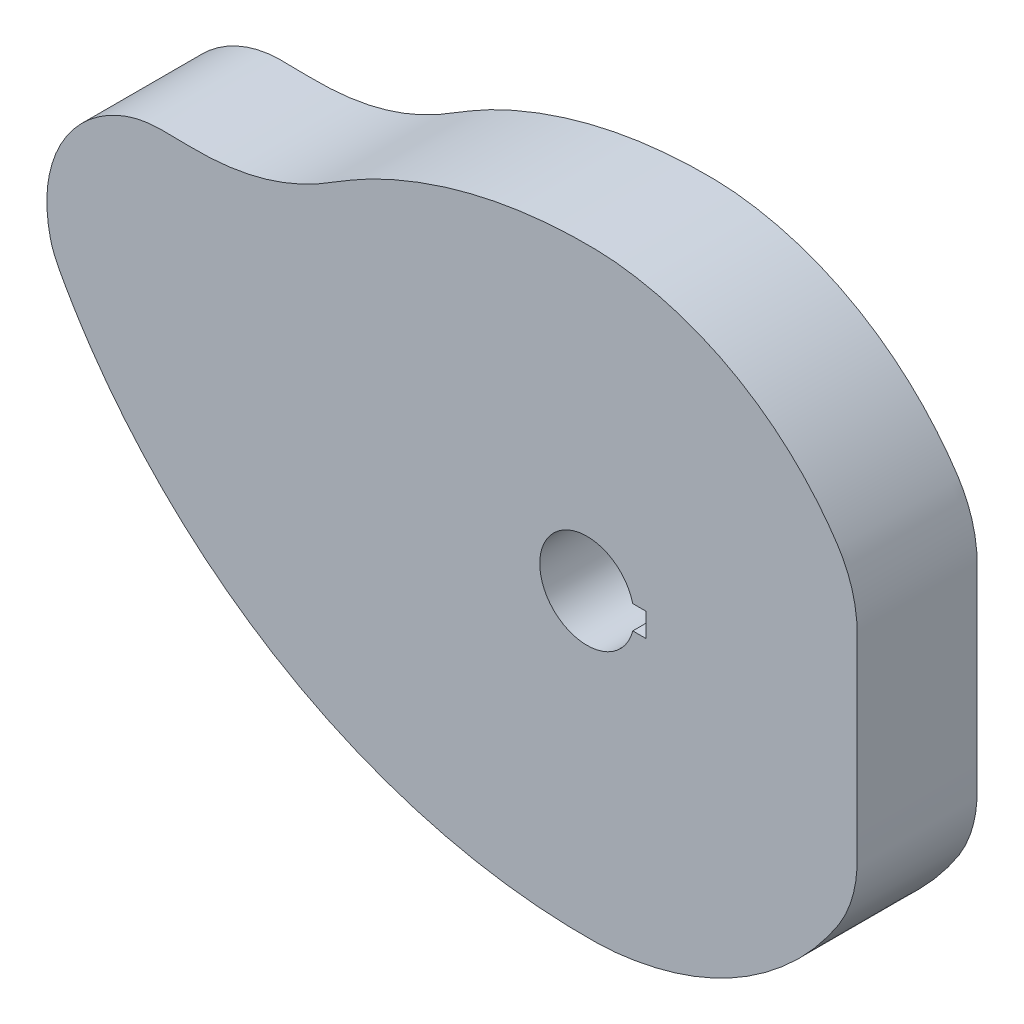
ISO-10303-21;
HEADER;
FILE_DESCRIPTION(('STEP AP214'),'2;1');
FILE_NAME('part.step','',(''),(''),'','','');
FILE_SCHEMA(('AUTOMOTIVE_DESIGN { 1 0 10303 214 1 1 1 1 }'));
ENDSEC;
DATA;
#1=APPLICATION_CONTEXT('core data for automotive mechanical design processes');
#2=APPLICATION_PROTOCOL_DEFINITION('international standard','automotive_design',2000,#1);
#3=PRODUCT_CONTEXT('',#1,'mechanical');
#4=PRODUCT('Part','Part','',(#3));
#5=PRODUCT_RELATED_PRODUCT_CATEGORY('part','',(#4));
#6=PRODUCT_DEFINITION_FORMATION('','',#4);
#7=PRODUCT_DEFINITION_CONTEXT('part definition',#1,'design');
#8=PRODUCT_DEFINITION('design','',#6,#7);
#9=PRODUCT_DEFINITION_SHAPE('','',#8);
#10=(LENGTH_UNIT() NAMED_UNIT(*) SI_UNIT(.MILLI.,.METRE.));
#11=(NAMED_UNIT(*) PLANE_ANGLE_UNIT() SI_UNIT($,.RADIAN.));
#12=(NAMED_UNIT(*) SI_UNIT($,.STERADIAN.) SOLID_ANGLE_UNIT());
#13=UNCERTAINTY_MEASURE_WITH_UNIT(LENGTH_MEASURE(1.E-05),#10,'distance_accuracy_value','');
#14=(GEOMETRIC_REPRESENTATION_CONTEXT(3) GLOBAL_UNCERTAINTY_ASSIGNED_CONTEXT((#13)) GLOBAL_UNIT_ASSIGNED_CONTEXT((#10,
#11,#12)) REPRESENTATION_CONTEXT('',''));
#15=CARTESIAN_POINT('',(0.,0.,0.));
#16=DIRECTION('',(0.,0.,1.));
#17=DIRECTION('',(1.,0.,0.));
#18=AXIS2_PLACEMENT_3D('',#15,#16,#17);
#19=CARTESIAN_POINT('',(-52.259233797283,-121.565831286042,25.4));
#20=DIRECTION('',(0.,0.,-1.));
#21=DIRECTION('',(-1.,0.,0.));
#22=AXIS2_PLACEMENT_3D('',#19,#20,#21);
#23=PLANE('',#22);
#24=CARTESIAN_POINT('',(-28.84960940884,124.941592011591,25.4));
#25=CARTESIAN_POINT('',(-48.0172973596402,122.192382834509,25.4));
#26=CARTESIAN_POINT('',(-66.6004944987315,116.749663241486,25.4));
#27=CARTESIAN_POINT('',(-84.2227067174397,108.723702302296,25.4));
#28=CARTESIAN_POINT('',(-88.8344062585629,106.623323534808,25.4));
#29=CARTESIAN_POINT('',(-97.900665141728,102.077540904734,25.4));
#30=CARTESIAN_POINT('',(-110.693663800941,93.768091000888,25.4));
#31=CARTESIAN_POINT('',(-119.707980614509,89.0740002139184,25.4));
#32=CARTESIAN_POINT('',(-124.364668699749,87.0753457412051,25.4));
#33=CARTESIAN_POINT('',(-134.644197589061,82.6633632300439,25.4));
#34=CARTESIAN_POINT('',(-145.507212428235,79.9933047159127,25.4));
#35=CARTESIAN_POINT('',(-156.660747873486,79.1371791780954,25.4));
#36=CARTESIAN_POINT('',(-161.496559267762,78.7659908987352,25.4));
#37=CARTESIAN_POINT('',(-171.221339831321,78.7161496068171,25.4));
#38=CARTESIAN_POINT('',(-186.352461546201,79.4198612164382,25.4));
#39=CARTESIAN_POINT('',(-195.681579205646,76.4217455758355,25.4));
#40=CARTESIAN_POINT('',(-200.042029759643,74.2982287885516,25.4));
#41=CARTESIAN_POINT('',(-217.372093969367,65.8585774685025,25.4));
#42=CARTESIAN_POINT('',(-227.881133526544,49.6994027524833,25.4));
#43=CARTESIAN_POINT('',(-228.567760678363,30.4357742502636,25.4));
#44=CARTESIAN_POINT('',(-228.675211048643,27.421206576962,25.4));
#45=CARTESIAN_POINT('',(-228.353100615053,21.3729301608058,25.4));
#46=CARTESIAN_POINT('',(-226.537007616112,12.0030729899717,25.4));
#47=CARTESIAN_POINT('',(-223.710348083425,6.67220053440763,25.4));
#48=CARTESIAN_POINT('',(-222.25,4.03277875791459,25.4));
#49=CARTESIAN_POINT('',(-220.786027211764,1.38680571811546,25.4));
#50=CARTESIAN_POINT('',(-217.763577608375,-3.85285285828359,25.4));
#51=CARTESIAN_POINT('',(-212.945017356871,-11.5563582692333,25.4));
#52=CARTESIAN_POINT('',(-209.556036578675,-16.5667507575796,25.4));
#53=CARTESIAN_POINT('',(-207.81736266284,-19.0408976138587,25.4));
#54=CARTESIAN_POINT('',(-165.939670094104,-78.6331883093797,25.4));
#55=CARTESIAN_POINT('',(-103.494941124399,-116.125028343193,25.4));
#56=CARTESIAN_POINT('',(-31.2116151987587,-125.075058418489,25.4));
#57=CARTESIAN_POINT('',(-27.7634006207359,-125.502011990204,25.4));
#58=CARTESIAN_POINT('',(-20.8494501652087,-126.214411474954,25.4));
#59=CARTESIAN_POINT('',(-10.4236393911341,-126.857411734703,25.4));
#60=CARTESIAN_POINT('',(-3.47454646371136,-127.,25.4));
#61=CARTESIAN_POINT('',(0.,-127.,25.4));
#62=CARTESIAN_POINT('',(3.46647594364313,-127.,25.4));
#63=CARTESIAN_POINT('',(10.3994278309294,-126.858073360616,25.4));
#64=CARTESIAN_POINT('',(20.8072055518038,-125.428027713954,25.4));
#65=CARTESIAN_POINT('',(27.6001690464834,-124.013092551042,25.4));
#66=CARTESIAN_POINT('',(30.9620496941261,-123.167980736628,25.4));
#67=CARTESIAN_POINT('',(59.4391898885441,-116.009378114641,25.4));
#68=CARTESIAN_POINT('',(83.8974747404313,-99.7617503722282,25.4));
#69=CARTESIAN_POINT('',(101.535282732004,-76.2862134368461,25.4));
#70=CARTESIAN_POINT('',(102.032465254216,-75.6244743664701,25.4));
#71=CARTESIAN_POINT('',(103.013891980486,-74.2912753161623,25.4));
#72=CARTESIAN_POINT('',(104.447260388009,-72.2621984616341,25.4));
#73=CARTESIAN_POINT('',(105.375804353249,-70.8916422856984,25.4));
#74=CARTESIAN_POINT('',(105.833333333333,-70.201891395856,25.4));
#75=CARTESIAN_POINT('',(106.289772373186,-69.5137836527371,25.4));
#76=CARTESIAN_POINT('',(107.189228624875,-68.128665132993,25.4));
#77=CARTESIAN_POINT('',(108.38736853485,-65.9499252792349,25.4));
#78=CARTESIAN_POINT('',(109.126133137904,-64.4723720235287,25.4));
#79=CARTESIAN_POINT('',(109.47729400244,-63.7250334720941,25.4));
#80=CARTESIAN_POINT('',(111.593713039351,-59.2208825344171,25.4));
#81=CARTESIAN_POINT('',(113.030335386188,-54.456145244519,25.4));
#82=CARTESIAN_POINT('',(113.756415965329,-49.5327914890216,25.4));
#83=CARTESIAN_POINT('',(113.876888839295,-48.7158978913724,25.4));
#84=CARTESIAN_POINT('',(114.077999962908,-47.0762360121631,25.4));
#85=CARTESIAN_POINT('',(114.3,-44.5983227127417,25.4));
#86=CARTESIAN_POINT('',(114.3,-42.9468641292563,25.4));
#87=CARTESIAN_POINT('',(114.3,-42.1211348375136,25.4));
#88=CARTESIAN_POINT('',(114.3,-41.2954055457709,25.4));
#89=CARTESIAN_POINT('',(114.3,-39.6439469622856,25.4));
#90=CARTESIAN_POINT('',(114.3,-37.1667590870575,25.4));
#91=CARTESIAN_POINT('',(114.3,-35.5153005035721,25.4));
#92=CARTESIAN_POINT('',(114.3,-34.6895712118295,25.4));
#93=CARTESIAN_POINT('',(114.3,-11.5631904039431,25.4));
#94=CARTESIAN_POINT('',(114.3,11.5631904039432,25.4));
#95=CARTESIAN_POINT('',(114.3,34.6895712118295,25.4));
#96=CARTESIAN_POINT('',(114.3,35.5153005035722,25.4));
#97=CARTESIAN_POINT('',(114.3,37.1667590870575,25.4));
#98=CARTESIAN_POINT('',(114.3,39.6439469622856,25.4));
#99=CARTESIAN_POINT('',(114.3,41.2954055457709,25.4));
#100=CARTESIAN_POINT('',(114.3,42.1211348375136,25.4));
#101=CARTESIAN_POINT('',(114.3,42.9468641292563,25.4));
#102=CARTESIAN_POINT('',(114.3,44.5983227127416,25.4));
#103=CARTESIAN_POINT('',(114.077999962908,47.076236012163,25.4));
#104=CARTESIAN_POINT('',(113.876888839295,48.7158978913724,25.4));
#105=CARTESIAN_POINT('',(113.756415965329,49.5327914890215,25.4));
#106=CARTESIAN_POINT('',(113.030335386188,54.456145244519,25.4));
#107=CARTESIAN_POINT('',(111.593713039351,59.2208825344171,25.4));
#108=CARTESIAN_POINT('',(109.47729400244,63.7250334720941,25.4));
#109=CARTESIAN_POINT('',(109.126133137904,64.4723720235287,25.4));
#110=CARTESIAN_POINT('',(108.38736853485,65.9499252792349,25.4));
#111=CARTESIAN_POINT('',(107.189228624875,68.128665132993,25.4));
#112=CARTESIAN_POINT('',(106.289772373186,69.5137836527371,25.4));
#113=CARTESIAN_POINT('',(105.833333333333,70.201891395856,25.4));
#114=CARTESIAN_POINT('',(105.375804353249,70.8916422856983,25.4));
#115=CARTESIAN_POINT('',(104.447260388009,72.2621984616341,25.4));
#116=CARTESIAN_POINT('',(103.013891980486,74.2912753161623,25.4));
#117=CARTESIAN_POINT('',(102.032465254216,75.6244743664701,25.4));
#118=CARTESIAN_POINT('',(101.535282732004,76.2862134368461,25.4));
#119=CARTESIAN_POINT('',(83.8974747404313,99.7617503722281,25.4));
#120=CARTESIAN_POINT('',(59.4391898885441,116.009378114641,25.4));
#121=CARTESIAN_POINT('',(30.9620496941261,123.167980736628,25.4));
#122=CARTESIAN_POINT('',(27.6001690464833,124.013092551042,25.4));
#123=CARTESIAN_POINT('',(20.8072055518037,125.428027713954,25.4));
#124=CARTESIAN_POINT('',(10.3994278309294,126.82259170077,25.4));
#125=CARTESIAN_POINT('',(3.46647594364314,127.,25.4));
#126=CARTESIAN_POINT('',(0.,127.,25.4));
#127=CARTESIAN_POINT('',(-3.21366105307736,127.,25.4));
#128=CARTESIAN_POINT('',(-9.6409831592321,126.847525334192,25.4));
#129=CARTESIAN_POINT('',(-19.2846412210536,126.159454223397,25.4));
#130=CARTESIAN_POINT('',(-25.6685026155249,125.397856116678,25.4));
#131=CARTESIAN_POINT('',(-28.84960940884,124.941592011591,25.4));
#132=(BOUNDED_CURVE() B_SPLINE_CURVE(3,(#24,#25,#26,#27,#28,#29,#30,#31,#32,#33,#34,#35,#36,#37,
#38,#39,#40,#41,#42,#43,#44,#45,#46,#47,#48,#49,#50,#51,#52,#53,#54,#55,#56,#57,#58,#59,#60,#61,
#62,#63,#64,#65,#66,#67,#68,#69,#70,#71,#72,#73,#74,#75,#76,#77,#78,#79,#80,#81,#82,#83,#84,#85,
#86,#87,#88,#89,#90,#91,#92,#93,#94,#95,#96,#97,#98,#99,#100,#101,#102,#103,#104,#105,#106,#107,
#108,#109,#110,#111,#112,#113,#114,#115,#116,#117,#118,#119,#120,#121,#122,#123,#124,#125,#126,
#127,#128,#129,#130,#131),.UNSPECIFIED.,.T.,.F.) B_SPLINE_CURVE_WITH_KNOTS((4,3,1,1,3,3,1,1,3,3,
1,1,3,1,1,3,3,1,1,3,1,1,3,3,1,1,3,1,1,3,3,1,1,3,1,1,3,3,1,1,3,1,1,3,3,1,1,3,1,1,3,3,1,1,3,1,1,
4),(0.,0.0611577489783689,0.0772714366643011,0.0933851243502334,0.109498812036166,
0.144749628302519,0.160171880714391,0.175594133126263,0.191016385538136,0.246475012386609,
0.256066888390429,0.265658764394248,0.275250640398068,0.28486632423202,0.294482008065972,
0.304097691899923,0.522437324040707,0.533485763419728,0.544534202798749,0.55558264217777,
0.566605418739309,0.577628195300849,0.588650971862388,0.678455419543698,0.681087361630865,
0.683719303718032,0.686351245805198,0.688976917995392,0.691602590185585,0.694228262375778,
0.70994009509362,0.712565767283813,0.715191439474007,0.7178171116642,0.720442783854393,
0.723068456044586,0.72569412823478,0.799231903331667,0.80185757552186,0.804483247712053,
0.807108919902247,0.80973459209244,0.812360264282633,0.814985936472826,0.830697769190669,
0.833323441380862,0.835949113571055,0.838574785761248,0.841206727848415,0.843838669935582,
0.846470612022749,0.936275059704061,0.9472978362656,0.95832061282714,0.969343389388679,
0.979562259592453,0.989781129796226,1.),
.UNSPECIFIED.) CURVE() GEOMETRIC_REPRESENTATION_ITEM() RATIONAL_B_SPLINE_CURVE((1.,
0.993246692951414,0.993246692951414,1.,1.,1.,1.,1.,1.,0.991010311958486,0.991010311958486,1.,1.,
1.,1.,1.,1.,0.904799807934197,0.904799807934197,1.,1.,1.,1.,1.,1.,1.,1.,1.,1.,1.,
0.942731011236939,0.942731011236939,1.,1.,1.,1.,1.,1.,1.,1.,1.,1.,1.,0.961817688978742,
0.961817688978742,1.,1.,1.,1.,1.,1.,1.,1.,1.,1.,1.,0.992866351251034,0.992866351251034,1.,1.,1.,
1.,1.,1.,1.,1.,1.,1.,1.,1.,1.,1.,1.,1.,1.,1.,1.,1.,1.,1.,1.,1.,0.992866351251034,
0.992866351251034,1.,1.,1.,1.,1.,1.,1.,1.,1.,1.,1.,0.961817688978742,0.961817688978742,1.,1.,1.,
1.,1.,1.,1.,1.,1.,1.,1.)) REPRESENTATION_ITEM(''));
#133=CARTESIAN_POINT('',(-28.84960940884,124.941592011591,25.4));
#134=VERTEX_POINT('',#133);
#135=EDGE_CURVE('E11',#134,#134,#132,.T.);
#136=ORIENTED_EDGE('',*,*,#135,.T.);
#137=EDGE_LOOP('',(#136));
#138=FACE_BOUND('',#137,.T.);
#139=DIRECTION('',(0.,1.,0.));
#140=VECTOR('',#139,1.);
#141=CARTESIAN_POINT('',(25.,5.,25.4));
#142=LINE('',#141,#140);
#143=CARTESIAN_POINT('',(25.,-5.,25.4));
#144=VERTEX_POINT('',#143);
#145=CARTESIAN_POINT('',(25.,5.,25.4));
#146=VERTEX_POINT('',#145);
#147=EDGE_CURVE('E93',#144,#146,#142,.T.);
#148=ORIENTED_EDGE('',*,*,#147,.F.);
#149=DIRECTION('',(1.,0.,0.));
#150=VECTOR('',#149,1.);
#151=CARTESIAN_POINT('',(19.3649167310371,-5.,25.4));
#152=LINE('',#151,#150);
#153=CARTESIAN_POINT('',(19.3649167310371,-5.,25.4));
#154=VERTEX_POINT('',#153);
#155=EDGE_CURVE('E107',#154,#144,#152,.T.);
#156=ORIENTED_EDGE('',*,*,#155,.F.);
#157=CARTESIAN_POINT('',(0.,0.,25.4));
#158=DIRECTION('',(0.,0.,1.));
#159=DIRECTION('',(1.,0.,0.));
#160=AXIS2_PLACEMENT_3D('',#157,#158,#159);
#161=CIRCLE('',#160,20.);
#162=CARTESIAN_POINT('',(19.3649167310371,5.,25.4));
#163=VERTEX_POINT('',#162);
#164=EDGE_CURVE('E105',#163,#154,#161,.T.);
#165=ORIENTED_EDGE('',*,*,#164,.F.);
#166=DIRECTION('',(-1.,0.,0.));
#167=VECTOR('',#166,1.);
#168=CARTESIAN_POINT('',(19.3649167310371,5.,25.4));
#169=LINE('',#168,#167);
#170=EDGE_CURVE('E103',#146,#163,#169,.T.);
#171=ORIENTED_EDGE('',*,*,#170,.F.);
#172=EDGE_LOOP('',(#148,#156,#165,#171));
#173=FACE_BOUND('',#172,.T.);
#174=ADVANCED_FACE('F34',(#138,#173),#23,.F.);
#175=CARTESIAN_POINT('',(-52.259233797283,-121.565831286042,-25.4));
#176=DIRECTION('',(0.,0.,-1.));
#177=DIRECTION('',(-1.,0.,0.));
#178=AXIS2_PLACEMENT_3D('',#175,#176,#177);
#179=PLANE('',#178);
#180=CARTESIAN_POINT('',(-28.84960940884,124.941592011591,-25.4));
#181=CARTESIAN_POINT('',(-48.0172973596402,122.192382834509,-25.4));
#182=CARTESIAN_POINT('',(-66.6004944987315,116.749663241486,-25.4));
#183=CARTESIAN_POINT('',(-84.2227067174397,108.723702302296,-25.4));
#184=CARTESIAN_POINT('',(-88.8344062585629,106.623323534808,-25.4));
#185=CARTESIAN_POINT('',(-97.900665141728,102.077540904734,-25.4));
#186=CARTESIAN_POINT('',(-110.693663800941,93.768091000888,-25.4));
#187=CARTESIAN_POINT('',(-119.707980614509,89.0740002139184,-25.4));
#188=CARTESIAN_POINT('',(-124.364668699749,87.0753457412051,-25.4));
#189=CARTESIAN_POINT('',(-134.644197589061,82.6633632300439,-25.4));
#190=CARTESIAN_POINT('',(-145.507212428235,79.9933047159127,-25.4));
#191=CARTESIAN_POINT('',(-156.660747873486,79.1371791780954,-25.4));
#192=CARTESIAN_POINT('',(-161.496559267762,78.7659908987352,-25.4));
#193=CARTESIAN_POINT('',(-171.221339831321,78.7161496068171,-25.4));
#194=CARTESIAN_POINT('',(-186.352461546201,79.4198612164382,-25.4));
#195=CARTESIAN_POINT('',(-195.681579205646,76.4217455758355,-25.4));
#196=CARTESIAN_POINT('',(-200.042029759643,74.2982287885516,-25.4));
#197=CARTESIAN_POINT('',(-217.372093969367,65.8585774685025,-25.4));
#198=CARTESIAN_POINT('',(-227.881133526544,49.6994027524833,-25.4));
#199=CARTESIAN_POINT('',(-228.567760678363,30.4357742502636,-25.4));
#200=CARTESIAN_POINT('',(-228.675211048643,27.421206576962,-25.4));
#201=CARTESIAN_POINT('',(-228.353100615053,21.3729301608058,-25.4));
#202=CARTESIAN_POINT('',(-226.537007616112,12.0030729899717,-25.4));
#203=CARTESIAN_POINT('',(-223.710348083425,6.67220053440763,-25.4));
#204=CARTESIAN_POINT('',(-222.25,4.03277875791459,-25.4));
#205=CARTESIAN_POINT('',(-220.786027211764,1.38680571811546,-25.4));
#206=CARTESIAN_POINT('',(-217.763577608375,-3.85285285828359,-25.4));
#207=CARTESIAN_POINT('',(-212.945017356871,-11.5563582692333,-25.4));
#208=CARTESIAN_POINT('',(-209.556036578675,-16.5667507575796,-25.4));
#209=CARTESIAN_POINT('',(-207.81736266284,-19.0408976138587,-25.4));
#210=CARTESIAN_POINT('',(-165.939670094104,-78.6331883093797,-25.4));
#211=CARTESIAN_POINT('',(-103.494941124399,-116.125028343193,-25.4));
#212=CARTESIAN_POINT('',(-31.2116151987587,-125.075058418489,-25.4));
#213=CARTESIAN_POINT('',(-27.7634006207359,-125.502011990204,-25.4));
#214=CARTESIAN_POINT('',(-20.8494501652087,-126.214411474954,-25.4));
#215=CARTESIAN_POINT('',(-10.4236393911341,-126.857411734703,-25.4));
#216=CARTESIAN_POINT('',(-3.47454646371136,-127.,-25.4));
#217=CARTESIAN_POINT('',(0.,-127.,-25.4));
#218=CARTESIAN_POINT('',(3.46647594364313,-127.,-25.4));
#219=CARTESIAN_POINT('',(10.3994278309294,-126.858073360616,-25.4));
#220=CARTESIAN_POINT('',(20.8072055518038,-125.428027713954,-25.4));
#221=CARTESIAN_POINT('',(27.6001690464834,-124.013092551042,-25.4));
#222=CARTESIAN_POINT('',(30.9620496941261,-123.167980736628,-25.4));
#223=CARTESIAN_POINT('',(59.4391898885441,-116.009378114641,-25.4));
#224=CARTESIAN_POINT('',(83.8974747404313,-99.7617503722282,-25.4));
#225=CARTESIAN_POINT('',(101.535282732004,-76.2862134368461,-25.4));
#226=CARTESIAN_POINT('',(102.032465254216,-75.6244743664701,-25.4));
#227=CARTESIAN_POINT('',(103.013891980486,-74.2912753161623,-25.4));
#228=CARTESIAN_POINT('',(104.447260388009,-72.2621984616341,-25.4));
#229=CARTESIAN_POINT('',(105.375804353249,-70.8916422856984,-25.4));
#230=CARTESIAN_POINT('',(105.833333333333,-70.201891395856,-25.4));
#231=CARTESIAN_POINT('',(106.289772373186,-69.5137836527371,-25.4));
#232=CARTESIAN_POINT('',(107.189228624875,-68.128665132993,-25.4));
#233=CARTESIAN_POINT('',(108.38736853485,-65.9499252792349,-25.4));
#234=CARTESIAN_POINT('',(109.126133137904,-64.4723720235287,-25.4));
#235=CARTESIAN_POINT('',(109.47729400244,-63.7250334720941,-25.4));
#236=CARTESIAN_POINT('',(111.593713039351,-59.2208825344171,-25.4));
#237=CARTESIAN_POINT('',(113.030335386188,-54.456145244519,-25.4));
#238=CARTESIAN_POINT('',(113.756415965329,-49.5327914890216,-25.4));
#239=CARTESIAN_POINT('',(113.876888839295,-48.7158978913724,-25.4));
#240=CARTESIAN_POINT('',(114.077999962908,-47.0762360121631,-25.4));
#241=CARTESIAN_POINT('',(114.3,-44.5983227127417,-25.4));
#242=CARTESIAN_POINT('',(114.3,-42.9468641292563,-25.4));
#243=CARTESIAN_POINT('',(114.3,-42.1211348375136,-25.4));
#244=CARTESIAN_POINT('',(114.3,-41.2954055457709,-25.4));
#245=CARTESIAN_POINT('',(114.3,-39.6439469622856,-25.4));
#246=CARTESIAN_POINT('',(114.3,-37.1667590870575,-25.4));
#247=CARTESIAN_POINT('',(114.3,-35.5153005035721,-25.4));
#248=CARTESIAN_POINT('',(114.3,-34.6895712118295,-25.4));
#249=CARTESIAN_POINT('',(114.3,-11.5631904039431,-25.4));
#250=CARTESIAN_POINT('',(114.3,11.5631904039432,-25.4));
#251=CARTESIAN_POINT('',(114.3,34.6895712118295,-25.4));
#252=CARTESIAN_POINT('',(114.3,35.5153005035722,-25.4));
#253=CARTESIAN_POINT('',(114.3,37.1667590870575,-25.4));
#254=CARTESIAN_POINT('',(114.3,39.6439469622856,-25.4));
#255=CARTESIAN_POINT('',(114.3,41.2954055457709,-25.4));
#256=CARTESIAN_POINT('',(114.3,42.1211348375136,-25.4));
#257=CARTESIAN_POINT('',(114.3,42.9468641292563,-25.4));
#258=CARTESIAN_POINT('',(114.3,44.5983227127416,-25.4));
#259=CARTESIAN_POINT('',(114.077999962908,47.076236012163,-25.4));
#260=CARTESIAN_POINT('',(113.876888839295,48.7158978913724,-25.4));
#261=CARTESIAN_POINT('',(113.756415965329,49.5327914890215,-25.4));
#262=CARTESIAN_POINT('',(113.030335386188,54.456145244519,-25.4));
#263=CARTESIAN_POINT('',(111.593713039351,59.2208825344171,-25.4));
#264=CARTESIAN_POINT('',(109.47729400244,63.7250334720941,-25.4));
#265=CARTESIAN_POINT('',(109.126133137904,64.4723720235287,-25.4));
#266=CARTESIAN_POINT('',(108.38736853485,65.9499252792349,-25.4));
#267=CARTESIAN_POINT('',(107.189228624875,68.128665132993,-25.4));
#268=CARTESIAN_POINT('',(106.289772373186,69.5137836527371,-25.4));
#269=CARTESIAN_POINT('',(105.833333333333,70.201891395856,-25.4));
#270=CARTESIAN_POINT('',(105.375804353249,70.8916422856983,-25.4));
#271=CARTESIAN_POINT('',(104.447260388009,72.2621984616341,-25.4));
#272=CARTESIAN_POINT('',(103.013891980486,74.2912753161623,-25.4));
#273=CARTESIAN_POINT('',(102.032465254216,75.6244743664701,-25.4));
#274=CARTESIAN_POINT('',(101.535282732004,76.2862134368461,-25.4));
#275=CARTESIAN_POINT('',(83.8974747404313,99.7617503722281,-25.4));
#276=CARTESIAN_POINT('',(59.4391898885441,116.009378114641,-25.4));
#277=CARTESIAN_POINT('',(30.9620496941261,123.167980736628,-25.4));
#278=CARTESIAN_POINT('',(27.6001690464833,124.013092551042,-25.4));
#279=CARTESIAN_POINT('',(20.8072055518037,125.428027713954,-25.4));
#280=CARTESIAN_POINT('',(10.3994278309294,126.82259170077,-25.4));
#281=CARTESIAN_POINT('',(3.46647594364314,127.,-25.4));
#282=CARTESIAN_POINT('',(0.,127.,-25.4));
#283=CARTESIAN_POINT('',(-3.21366105307736,127.,-25.4));
#284=CARTESIAN_POINT('',(-9.6409831592321,126.847525334192,-25.4));
#285=CARTESIAN_POINT('',(-19.2846412210536,126.159454223397,-25.4));
#286=CARTESIAN_POINT('',(-25.6685026155249,125.397856116678,-25.4));
#287=CARTESIAN_POINT('',(-28.84960940884,124.941592011591,-25.4));
#288=(BOUNDED_CURVE() B_SPLINE_CURVE(3,(#180,#181,#182,#183,#184,#185,#186,#187,#188,#189,#190,
#191,#192,#193,#194,#195,#196,#197,#198,#199,#200,#201,#202,#203,#204,#205,#206,#207,#208,#209,
#210,#211,#212,#213,#214,#215,#216,#217,#218,#219,#220,#221,#222,#223,#224,#225,#226,#227,#228,
#229,#230,#231,#232,#233,#234,#235,#236,#237,#238,#239,#240,#241,#242,#243,#244,#245,#246,#247,
#248,#249,#250,#251,#252,#253,#254,#255,#256,#257,#258,#259,#260,#261,#262,#263,#264,#265,#266,
#267,#268,#269,#270,#271,#272,#273,#274,#275,#276,#277,#278,#279,#280,#281,#282,#283,#284,#285,
#286,#287),.UNSPECIFIED.,.T.,.F.) B_SPLINE_CURVE_WITH_KNOTS((4,3,1,1,3,3,1,1,3,3,1,1,3,1,1,3,3,
1,1,3,1,1,3,3,1,1,3,1,1,3,3,1,1,3,1,1,3,3,1,1,3,1,1,3,3,1,1,3,1,1,3,3,1,1,3,1,1,4),(0.,
0.0611577489783689,0.0772714366643011,0.0933851243502334,0.109498812036166,0.144749628302519,
0.160171880714391,0.175594133126263,0.191016385538136,0.246475012386609,0.256066888390429,
0.265658764394248,0.275250640398068,0.28486632423202,0.294482008065972,0.304097691899923,
0.522437324040707,0.533485763419728,0.544534202798749,0.55558264217777,0.566605418739309,
0.577628195300849,0.588650971862388,0.678455419543698,0.681087361630865,0.683719303718032,
0.686351245805198,0.688976917995392,0.691602590185585,0.694228262375778,0.70994009509362,
0.712565767283813,0.715191439474007,0.7178171116642,0.720442783854393,0.723068456044586,
0.72569412823478,0.799231903331667,0.80185757552186,0.804483247712053,0.807108919902247,
0.80973459209244,0.812360264282633,0.814985936472826,0.830697769190669,0.833323441380862,
0.835949113571055,0.838574785761248,0.841206727848415,0.843838669935582,0.846470612022749,
0.936275059704061,0.9472978362656,0.95832061282714,0.969343389388679,0.979562259592453,
0.989781129796226,1.),
.UNSPECIFIED.) CURVE() GEOMETRIC_REPRESENTATION_ITEM() RATIONAL_B_SPLINE_CURVE((1.,
0.993246692951414,0.993246692951414,1.,1.,1.,1.,1.,1.,0.991010311958486,0.991010311958486,1.,1.,
1.,1.,1.,1.,0.904799807934197,0.904799807934197,1.,1.,1.,1.,1.,1.,1.,1.,1.,1.,1.,
0.942731011236939,0.942731011236939,1.,1.,1.,1.,1.,1.,1.,1.,1.,1.,1.,0.961817688978742,
0.961817688978742,1.,1.,1.,1.,1.,1.,1.,1.,1.,1.,1.,0.992866351251034,0.992866351251034,1.,1.,1.,
1.,1.,1.,1.,1.,1.,1.,1.,1.,1.,1.,1.,1.,1.,1.,1.,1.,1.,1.,1.,1.,0.992866351251034,
0.992866351251034,1.,1.,1.,1.,1.,1.,1.,1.,1.,1.,1.,0.961817688978742,0.961817688978742,1.,1.,1.,
1.,1.,1.,1.,1.,1.,1.,1.)) REPRESENTATION_ITEM(''));
#289=CARTESIAN_POINT('',(-28.84960940884,124.941592011591,-25.4));
#290=VERTEX_POINT('',#289);
#291=EDGE_CURVE('E45',#290,#290,#288,.T.);
#292=ORIENTED_EDGE('',*,*,#291,.F.);
#293=EDGE_LOOP('',(#292));
#294=FACE_BOUND('',#293,.T.);
#295=DIRECTION('',(1.,0.,0.));
#296=VECTOR('',#295,1.);
#297=CARTESIAN_POINT('',(19.3649167310371,-5.,-25.4));
#298=LINE('',#297,#296);
#299=CARTESIAN_POINT('',(19.3649167310371,-5.,-25.4));
#300=VERTEX_POINT('',#299);
#301=CARTESIAN_POINT('',(25.,-5.,-25.4));
#302=VERTEX_POINT('',#301);
#303=EDGE_CURVE('E97',#300,#302,#298,.T.);
#304=ORIENTED_EDGE('',*,*,#303,.T.);
#305=DIRECTION('',(0.,1.,0.));
#306=VECTOR('',#305,1.);
#307=CARTESIAN_POINT('',(25.,5.,-25.4));
#308=LINE('',#307,#306);
#309=CARTESIAN_POINT('',(25.,5.,-25.4));
#310=VERTEX_POINT('',#309);
#311=EDGE_CURVE('E60',#302,#310,#308,.T.);
#312=ORIENTED_EDGE('',*,*,#311,.T.);
#313=DIRECTION('',(-1.,0.,0.));
#314=VECTOR('',#313,1.);
#315=CARTESIAN_POINT('',(19.3649167310371,5.,-25.4));
#316=LINE('',#315,#314);
#317=CARTESIAN_POINT('',(19.3649167310371,5.,-25.4));
#318=VERTEX_POINT('',#317);
#319=EDGE_CURVE('E80',#310,#318,#316,.T.);
#320=ORIENTED_EDGE('',*,*,#319,.T.);
#321=CARTESIAN_POINT('',(0.,0.,-25.4));
#322=DIRECTION('',(0.,0.,1.));
#323=DIRECTION('',(1.,0.,0.));
#324=AXIS2_PLACEMENT_3D('',#321,#322,#323);
#325=CIRCLE('',#324,20.);
#326=EDGE_CURVE('E89',#318,#300,#325,.T.);
#327=ORIENTED_EDGE('',*,*,#326,.T.);
#328=EDGE_LOOP('',(#304,#312,#320,#327));
#329=FACE_BOUND('',#328,.T.);
#330=ADVANCED_FACE('F96',(#294,#329),#179,.T.);
#331=DIRECTION('',(0.,0.,-1.));
#332=VECTOR('',#331,1.);
#333=SURFACE_OF_LINEAR_EXTRUSION('',#132,#332);
#334=ORIENTED_EDGE('',*,*,#135,.F.);
#335=EDGE_LOOP('',(#334));
#336=FACE_BOUND('',#335,.T.);
#337=ORIENTED_EDGE('',*,*,#291,.T.);
#338=EDGE_LOOP('',(#337));
#339=FACE_BOUND('',#338,.T.);
#340=ADVANCED_FACE('F36',(#336,#339),#333,.F.);
#341=CARTESIAN_POINT('',(25.,5.,25.4));
#342=DIRECTION('',(-1.,0.,0.));
#343=DIRECTION('',(0.,0.,1.));
#344=AXIS2_PLACEMENT_3D('',#341,#342,#343);
#345=PLANE('',#344);
#346=ORIENTED_EDGE('',*,*,#311,.F.);
#347=DIRECTION('',(0.,0.,-1.));
#348=VECTOR('',#347,1.);
#349=CARTESIAN_POINT('',(25.,-5.,25.4));
#350=LINE('',#349,#348);
#351=EDGE_CURVE('E109',#144,#302,#350,.T.);
#352=ORIENTED_EDGE('',*,*,#351,.F.);
#353=ORIENTED_EDGE('',*,*,#147,.T.);
#354=DIRECTION('',(0.,0.,-1.));
#355=VECTOR('',#354,1.);
#356=CARTESIAN_POINT('',(25.,5.,25.4));
#357=LINE('',#356,#355);
#358=EDGE_CURVE('E82',#146,#310,#357,.T.);
#359=ORIENTED_EDGE('',*,*,#358,.T.);
#360=EDGE_LOOP('',(#346,#352,#353,#359));
#361=FACE_BOUND('',#360,.T.);
#362=ADVANCED_FACE('F91',(#361),#345,.T.);
#363=CARTESIAN_POINT('',(19.3649167310371,5.,25.4));
#364=DIRECTION('',(0.,-1.,0.));
#365=DIRECTION('',(0.,0.,-1.));
#366=AXIS2_PLACEMENT_3D('',#363,#364,#365);
#367=PLANE('',#366);
#368=ORIENTED_EDGE('',*,*,#319,.F.);
#369=ORIENTED_EDGE('',*,*,#358,.F.);
#370=ORIENTED_EDGE('',*,*,#170,.T.);
#371=DIRECTION('',(0.,0.,-1.));
#372=VECTOR('',#371,1.);
#373=CARTESIAN_POINT('',(19.3649167310371,5.,25.4));
#374=LINE('',#373,#372);
#375=EDGE_CURVE('E85',#163,#318,#374,.T.);
#376=ORIENTED_EDGE('',*,*,#375,.T.);
#377=EDGE_LOOP('',(#368,#369,#370,#376));
#378=FACE_BOUND('',#377,.T.);
#379=ADVANCED_FACE('F81',(#378),#367,.T.);
#380=CARTESIAN_POINT('',(0.,0.,25.4));
#381=DIRECTION('',(0.,0.,-1.));
#382=DIRECTION('',(-1.,0.,0.));
#383=AXIS2_PLACEMENT_3D('',#380,#381,#382);
#384=CYLINDRICAL_SURFACE('',#383,20.);
#385=ORIENTED_EDGE('',*,*,#326,.F.);
#386=ORIENTED_EDGE('',*,*,#375,.F.);
#387=ORIENTED_EDGE('',*,*,#164,.T.);
#388=DIRECTION('',(0.,0.,-1.));
#389=VECTOR('',#388,1.);
#390=CARTESIAN_POINT('',(19.3649167310371,-5.,25.4));
#391=LINE('',#390,#389);
#392=EDGE_CURVE('E52',#154,#300,#391,.T.);
#393=ORIENTED_EDGE('',*,*,#392,.T.);
#394=EDGE_LOOP('',(#385,#386,#387,#393));
#395=FACE_BOUND('',#394,.T.);
#396=ADVANCED_FACE('F134',(#395),#384,.F.);
#397=CARTESIAN_POINT('',(19.3649167310371,-5.,25.4));
#398=DIRECTION('',(0.,1.,0.));
#399=DIRECTION('',(0.,0.,1.));
#400=AXIS2_PLACEMENT_3D('',#397,#398,#399);
#401=PLANE('',#400);
#402=ORIENTED_EDGE('',*,*,#303,.F.);
#403=ORIENTED_EDGE('',*,*,#392,.F.);
#404=ORIENTED_EDGE('',*,*,#155,.T.);
#405=ORIENTED_EDGE('',*,*,#351,.T.);
#406=EDGE_LOOP('',(#402,#403,#404,#405));
#407=FACE_BOUND('',#406,.T.);
#408=ADVANCED_FACE('F137',(#407),#401,.T.);
#409=CLOSED_SHELL('',(#174,#330,#340,#362,#379,#396,#408));
#410=MANIFOLD_SOLID_BREP('B2',#409);
#411=ADVANCED_BREP_SHAPE_REPRESENTATION('',(#18,#410),#14);
#412=SHAPE_DEFINITION_REPRESENTATION(#9,#411);
ENDSEC;
END-ISO-10303-21;
